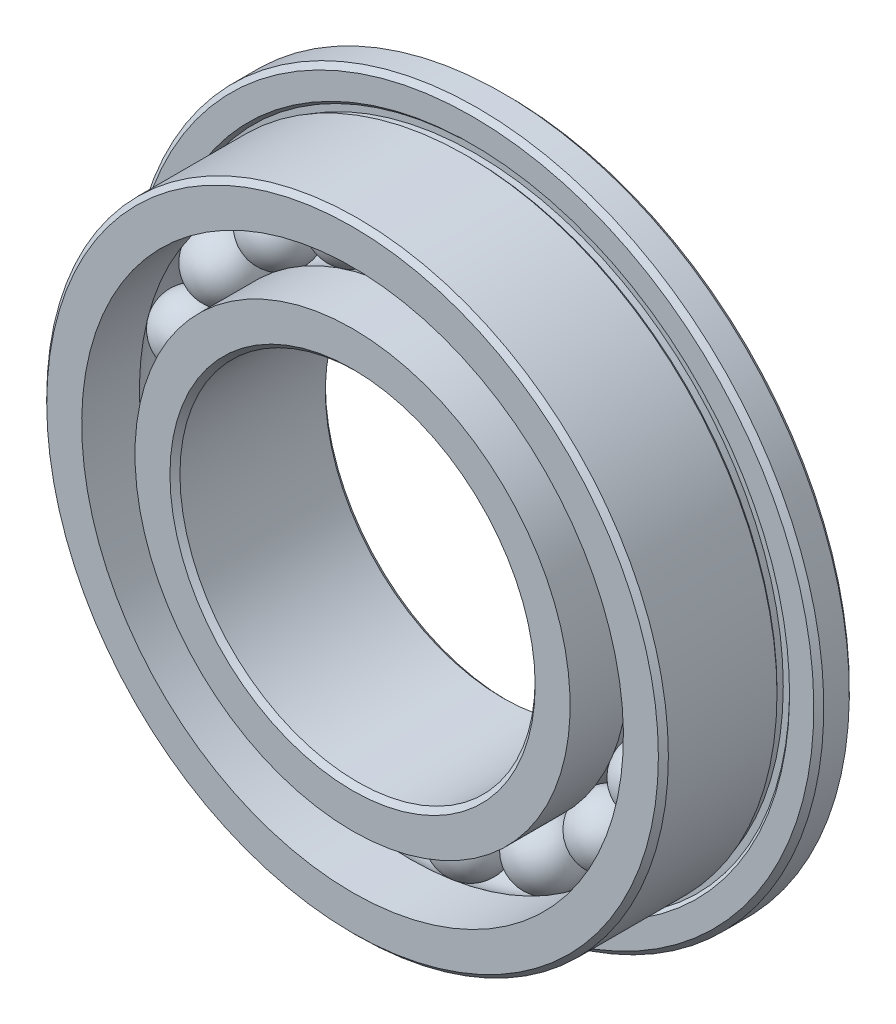
ISO-10303-21;
HEADER;
FILE_DESCRIPTION(('STEP AP214'),'2;1');
FILE_NAME('part.step','',(''),(''),'','','');
FILE_SCHEMA(('AUTOMOTIVE_DESIGN { 1 0 10303 214 1 1 1 1 }'));
ENDSEC;
DATA;
#1=APPLICATION_CONTEXT('core data for automotive mechanical design processes');
#2=APPLICATION_PROTOCOL_DEFINITION('international standard','automotive_design',2000,#1);
#3=PRODUCT_CONTEXT('',#1,'mechanical');
#4=PRODUCT('Part','Part','',(#3));
#5=PRODUCT_RELATED_PRODUCT_CATEGORY('part','',(#4));
#6=PRODUCT_DEFINITION_FORMATION('','',#4);
#7=PRODUCT_DEFINITION_CONTEXT('part definition',#1,'design');
#8=PRODUCT_DEFINITION('design','',#6,#7);
#9=PRODUCT_DEFINITION_SHAPE('','',#8);
#10=(LENGTH_UNIT() NAMED_UNIT(*) SI_UNIT(.MILLI.,.METRE.));
#11=(NAMED_UNIT(*) PLANE_ANGLE_UNIT() SI_UNIT($,.RADIAN.));
#12=(NAMED_UNIT(*) SI_UNIT($,.STERADIAN.) SOLID_ANGLE_UNIT());
#13=UNCERTAINTY_MEASURE_WITH_UNIT(LENGTH_MEASURE(1.E-05),#10,'distance_accuracy_value','');
#14=(GEOMETRIC_REPRESENTATION_CONTEXT(3) GLOBAL_UNCERTAINTY_ASSIGNED_CONTEXT((#13)) GLOBAL_UNIT_ASSIGNED_CONTEXT((#10,
#11,#12)) REPRESENTATION_CONTEXT('',''));
#15=CARTESIAN_POINT('',(0.,0.,0.));
#16=DIRECTION('',(0.,0.,1.));
#17=DIRECTION('',(1.,0.,0.));
#18=AXIS2_PLACEMENT_3D('',#15,#16,#17);
#19=CARTESIAN_POINT('',(-1.78584708062569,5.20199482935352,0.));
#20=DIRECTION('',(-0.324699469204671,0.945817241700639,0.));
#21=DIRECTION('',(0.945817241700639,0.324699469204671,0.));
#22=AXIS2_PLACEMENT_3D('',#19,#20,#21);
#23=SPHERICAL_SURFACE('',#22,0.75);
#24=CARTESIAN_POINT('',(-2.02937168252919,5.911357760629,0.));
#25=VERTEX_POINT('',#24);
#26=VERTEX_LOOP('',#25);
#27=FACE_BOUND('',#26,.T.);
#28=ADVANCED_FACE('F56',(#27),#23,.T.);
#29=CLOSED_SHELL('',(#28));
#30=MANIFOLD_SOLID_BREP('B2',#29);
#31=CARTESIAN_POINT('',(-3.37816991979312,4.34027280168021,0.));
#32=DIRECTION('',(-0.614212712689658,0.789140509396402,0.));
#33=DIRECTION('',(0.789140509396402,0.614212712689658,0.));
#34=AXIS2_PLACEMENT_3D('',#31,#32,#33);
#35=SPHERICAL_SURFACE('',#34,0.75);
#36=CARTESIAN_POINT('',(-3.83882945431036,4.93212818372751,0.));
#37=VERTEX_POINT('',#36);
#38=VERTEX_LOOP('',#37);
#39=FACE_BOUND('',#38,.T.);
#40=ADVANCED_FACE('F77',(#39),#35,.T.);
#41=CLOSED_SHELL('',(#40));
#42=MANIFOLD_SOLID_BREP('B7',#41);
#43=CARTESIAN_POINT('',(-4.60441563044387,3.0082148696734,0.));
#44=DIRECTION('',(-0.837166478262522,0.546948158122437,0.));
#45=DIRECTION('',(0.546948158122437,0.837166478262522,0.));
#46=AXIS2_PLACEMENT_3D('',#43,#44,#45);
#47=SPHERICAL_SURFACE('',#46,0.75);
#48=CARTESIAN_POINT('',(-5.23229048914076,3.41842598826523,0.));
#49=VERTEX_POINT('',#48);
#50=VERTEX_LOOP('',#49);
#51=FACE_BOUND('',#50,.T.);
#52=ADVANCED_FACE('F98',(#51),#47,.T.);
#53=CLOSED_SHELL('',(#52));
#54=MANIFOLD_SOLID_BREP('B52',#53);
#55=CARTESIAN_POINT('',(-5.3317014626663,1.35017017927445,0.));
#56=DIRECTION('',(-0.969400265939328,0.24548548714081,0.));
#57=DIRECTION('',(0.24548548714081,0.969400265939328,0.));
#58=AXIS2_PLACEMENT_3D('',#55,#56,#57);
#59=SPHERICAL_SURFACE('',#58,0.75);
#60=CARTESIAN_POINT('',(-6.0587516621208,1.53428429463006,0.));
#61=VERTEX_POINT('',#60);
#62=VERTEX_LOOP('',#61);
#63=FACE_BOUND('',#62,.T.);
#64=ADVANCED_FACE('F119',(#63),#59,.T.);
#65=CLOSED_SHELL('',(#64));
#66=MANIFOLD_SOLID_BREP('B73',#65);
#67=CARTESIAN_POINT('',(-5.48121471153669,-0.454186400097772,0.));
#68=DIRECTION('',(-0.996584493006671,-0.0825793454723223,0.));
#69=DIRECTION('',(-0.0825793454723223,0.996584493006671,0.));
#70=AXIS2_PLACEMENT_3D('',#67,#68,#69);
#71=SPHERICAL_SURFACE('',#70,0.75);
#72=CARTESIAN_POINT('',(-6.22865308129169,-0.516120909202013,0.));
#73=VERTEX_POINT('',#72);
#74=VERTEX_LOOP('',#73);
#75=FACE_BOUND('',#74,.T.);
#76=ADVANCED_FACE('F140',(#75),#71,.T.);
#77=CLOSED_SHELL('',(#76));
#78=MANIFOLD_SOLID_BREP('B94',#77);
#79=CARTESIAN_POINT('',(-5.03675329660284,-2.20932483559128,0.));
#80=DIRECTION('',(-0.915773326655062,-0.40169542465296,0.));
#81=DIRECTION('',(-0.40169542465296,0.915773326655062,0.));
#82=AXIS2_PLACEMENT_3D('',#79,#80,#81);
#83=SPHERICAL_SURFACE('',#82,0.75);
#84=CARTESIAN_POINT('',(-5.72358329159414,-2.510596404081,0.));
#85=VERTEX_POINT('',#84);
#86=VERTEX_LOOP('',#85);
#87=FACE_BOUND('',#86,.T.);
#88=ADVANCED_FACE('F161',(#87),#83,.T.);
#89=CLOSED_SHELL('',(#88));
#90=MANIFOLD_SOLID_BREP('B115',#89);
#91=CARTESIAN_POINT('',(-4.04648150870226,-3.72504864394154,0.));
#92=DIRECTION('',(-0.735723910673138,-0.677281571625734,0.));
#93=DIRECTION('',(-0.677281571625734,0.735723910673138,0.));
#94=AXIS2_PLACEMENT_3D('',#91,#92,#93);
#95=SPHERICAL_SURFACE('',#94,0.75);
#96=CARTESIAN_POINT('',(-4.59827444170711,-4.23300982266084,0.));
#97=VERTEX_POINT('',#96);
#98=VERTEX_LOOP('',#97);
#99=FACE_BOUND('',#98,.T.);
#100=ADVANCED_FACE('F182',(#99),#95,.T.);
#101=CLOSED_SHELL('',(#100));
#102=MANIFOLD_SOLID_BREP('B136',#101);
#103=CARTESIAN_POINT('',(-2.61771066170394,-4.83710563163567,0.));
#104=DIRECTION('',(-0.475947393037081,-0.879473751206485,0.));
#105=DIRECTION('',(-0.879473751206485,0.475947393037081,0.));
#106=AXIS2_PLACEMENT_3D('',#103,#104,#105);
#107=SPHERICAL_SURFACE('',#106,0.75);
#108=CARTESIAN_POINT('',(-2.97467120648176,-5.49671094504053,0.));
#109=VERTEX_POINT('',#108);
#110=VERTEX_LOOP('',#109);
#111=FACE_BOUND('',#110,.T.);
#112=ADVANCED_FACE('F203',(#111),#107,.T.);
#113=CLOSED_SHELL('',(#112));
#114=MANIFOLD_SOLID_BREP('B157',#113);
#115=CARTESIAN_POINT('',(-0.905270246544077,-5.42498716871497,0.));
#116=DIRECTION('',(-0.164594590280741,-0.986361303402721,0.));
#117=DIRECTION('',(-0.986361303402721,0.164594590280741,0.));
#118=AXIS2_PLACEMENT_3D('',#115,#116,#117);
#119=SPHERICAL_SURFACE('',#118,0.75);
#120=CARTESIAN_POINT('',(-1.02871618925463,-6.16475814626701,0.));
#121=VERTEX_POINT('',#120);
#122=VERTEX_LOOP('',#121);
#123=FACE_BOUND('',#122,.T.);
#124=ADVANCED_FACE('F224',(#123),#119,.T.);
#125=CLOSED_SHELL('',(#124));
#126=MANIFOLD_SOLID_BREP('B178',#125);
#127=CARTESIAN_POINT('',(0.905270246543999,-5.42498716871498,0.));
#128=DIRECTION('',(0.164594590280727,-0.986361303402724,0.));
#129=DIRECTION('',(-0.986361303402724,-0.164594590280727,0.));
#130=AXIS2_PLACEMENT_3D('',#127,#128,#129);
#131=SPHERICAL_SURFACE('',#130,0.75);
#132=CARTESIAN_POINT('',(1.02871618925454,-6.16475814626702,0.));
#133=VERTEX_POINT('',#132);
#134=VERTEX_LOOP('',#133);
#135=FACE_BOUND('',#134,.T.);
#136=ADVANCED_FACE('F245',(#135),#131,.T.);
#137=CLOSED_SHELL('',(#136));
#138=MANIFOLD_SOLID_BREP('B199',#137);
#139=CARTESIAN_POINT('',(2.61771066170388,-4.8371056316357,0.));
#140=DIRECTION('',(0.475947393037068,-0.879473751206492,0.));
#141=DIRECTION('',(-0.879473751206492,-0.475947393037068,0.));
#142=AXIS2_PLACEMENT_3D('',#139,#140,#141);
#143=SPHERICAL_SURFACE('',#142,0.75);
#144=CARTESIAN_POINT('',(2.97467120648168,-5.49671094504057,0.));
#145=VERTEX_POINT('',#144);
#146=VERTEX_LOOP('',#145);
#147=FACE_BOUND('',#146,.T.);
#148=ADVANCED_FACE('F266',(#147),#143,.T.);
#149=CLOSED_SHELL('',(#148));
#150=MANIFOLD_SOLID_BREP('B220',#149);
#151=CARTESIAN_POINT('',(4.0464815087022,-3.7250486439416,0.));
#152=DIRECTION('',(0.735723910673128,-0.677281571625745,0.));
#153=DIRECTION('',(-0.677281571625745,-0.735723910673128,0.));
#154=AXIS2_PLACEMENT_3D('',#151,#152,#153);
#155=SPHERICAL_SURFACE('',#154,0.75);
#156=CARTESIAN_POINT('',(4.59827444170705,-4.2330098226609,0.));
#157=VERTEX_POINT('',#156);
#158=VERTEX_LOOP('',#157);
#159=FACE_BOUND('',#158,.T.);
#160=ADVANCED_FACE('F287',(#159),#155,.T.);
#161=CLOSED_SHELL('',(#160));
#162=MANIFOLD_SOLID_BREP('B241',#161);
#163=CARTESIAN_POINT('',(5.03675329660281,-2.20932483559136,0.));
#164=DIRECTION('',(0.915773326655056,-0.401695424652974,0.));
#165=DIRECTION('',(-0.401695424652974,-0.915773326655056,0.));
#166=AXIS2_PLACEMENT_3D('',#163,#164,#165);
#167=SPHERICAL_SURFACE('',#166,0.75);
#168=CARTESIAN_POINT('',(5.7235832915941,-2.51059640408109,0.));
#169=VERTEX_POINT('',#168);
#170=VERTEX_LOOP('',#169);
#171=FACE_BOUND('',#170,.T.);
#172=ADVANCED_FACE('F308',(#171),#167,.T.);
#173=CLOSED_SHELL('',(#172));
#174=MANIFOLD_SOLID_BREP('B262',#173);
#175=CARTESIAN_POINT('',(5.48121471153668,-0.454186400097848,0.));
#176=DIRECTION('',(0.99658449300667,-0.0825793454723359,0.));
#177=DIRECTION('',(-0.0825793454723359,-0.99658449300667,0.));
#178=AXIS2_PLACEMENT_3D('',#175,#176,#177);
#179=SPHERICAL_SURFACE('',#178,0.75);
#180=CARTESIAN_POINT('',(6.22865308129169,-0.5161209092021,0.));
#181=VERTEX_POINT('',#180);
#182=VERTEX_LOOP('',#181);
#183=FACE_BOUND('',#182,.T.);
#184=ADVANCED_FACE('F329',(#183),#179,.T.);
#185=CLOSED_SHELL('',(#184));
#186=MANIFOLD_SOLID_BREP('B283',#185);
#187=CARTESIAN_POINT('',(5.33170146266632,1.35017017927438,0.));
#188=DIRECTION('',(0.969400265939331,0.245485487140796,0.));
#189=DIRECTION('',(0.245485487140796,-0.969400265939331,0.));
#190=AXIS2_PLACEMENT_3D('',#187,#188,#189);
#191=SPHERICAL_SURFACE('',#190,0.75);
#192=CARTESIAN_POINT('',(6.05875166212082,1.53428429462998,0.));
#193=VERTEX_POINT('',#192);
#194=VERTEX_LOOP('',#193);
#195=FACE_BOUND('',#194,.T.);
#196=ADVANCED_FACE('F350',(#195),#191,.T.);
#197=CLOSED_SHELL('',(#196));
#198=MANIFOLD_SOLID_BREP('B304',#197);
#199=CARTESIAN_POINT('',(4.60441563044391,3.00821486967334,0.));
#200=DIRECTION('',(0.83716647826253,0.546948158122425,0.));
#201=DIRECTION('',(0.546948158122425,-0.83716647826253,0.));
#202=AXIS2_PLACEMENT_3D('',#199,#200,#201);
#203=SPHERICAL_SURFACE('',#202,0.75);
#204=CARTESIAN_POINT('',(5.23229048914081,3.41842598826516,0.));
#205=VERTEX_POINT('',#204);
#206=VERTEX_LOOP('',#205);
#207=FACE_BOUND('',#206,.T.);
#208=ADVANCED_FACE('F371',(#207),#203,.T.);
#209=CLOSED_SHELL('',(#208));
#210=MANIFOLD_SOLID_BREP('B325',#209);
#211=CARTESIAN_POINT('',(3.37816991979318,4.34027280168016,0.));
#212=DIRECTION('',(0.614212712689669,0.789140509396393,0.));
#213=DIRECTION('',(0.789140509396393,-0.614212712689669,0.));
#214=AXIS2_PLACEMENT_3D('',#211,#212,#213);
#215=SPHERICAL_SURFACE('',#214,0.75);
#216=CARTESIAN_POINT('',(3.83882945431043,4.93212818372745,0.));
#217=VERTEX_POINT('',#216);
#218=VERTEX_LOOP('',#217);
#219=FACE_BOUND('',#218,.T.);
#220=ADVANCED_FACE('F392',(#219),#215,.T.);
#221=CLOSED_SHELL('',(#220));
#222=MANIFOLD_SOLID_BREP('B346',#221);
#223=CARTESIAN_POINT('',(1.78584708062576,5.20199482935349,0.));
#224=DIRECTION('',(0.324699469204684,0.945817241700635,0.));
#225=DIRECTION('',(0.945817241700635,-0.324699469204684,0.));
#226=AXIS2_PLACEMENT_3D('',#223,#224,#225);
#227=SPHERICAL_SURFACE('',#226,0.75);
#228=CARTESIAN_POINT('',(2.02937168252928,5.91135776062897,0.));
#229=VERTEX_POINT('',#228);
#230=VERTEX_LOOP('',#229);
#231=FACE_BOUND('',#230,.T.);
#232=ADVANCED_FACE('F413',(#231),#227,.T.);
#233=CLOSED_SHELL('',(#232));
#234=MANIFOLD_SOLID_BREP('B367',#233);
#235=CARTESIAN_POINT('',(0.,5.5,0.));
#236=DIRECTION('',(0.,1.,0.));
#237=DIRECTION('',(1.,0.,0.));
#238=AXIS2_PLACEMENT_3D('',#235,#236,#237);
#239=SPHERICAL_SURFACE('',#238,0.75);
#240=CARTESIAN_POINT('',(0.,6.25,0.));
#241=VERTEX_POINT('',#240);
#242=VERTEX_LOOP('',#241);
#243=FACE_BOUND('',#242,.T.);
#244=ADVANCED_FACE('F437',(#243),#239,.T.);
#245=CLOSED_SHELL('',(#244));
#246=MANIFOLD_SOLID_BREP('B388',#245);
#247=CARTESIAN_POINT('',(0.,0.,0.));
#248=DIRECTION('',(0.,0.,1.));
#249=DIRECTION('',(0.,-1.,0.));
#250=AXIS2_PLACEMENT_3D('',#247,#248,#249);
#251=CYLINDRICAL_SURFACE('',#250,4.9);
#252=CARTESIAN_POINT('',(0.,0.,-0.449999999999999));
#253=DIRECTION('',(0.,0.,1.));
#254=DIRECTION('',(0.,-1.,0.));
#255=AXIS2_PLACEMENT_3D('',#252,#253,#254);
#256=CIRCLE('',#255,4.9);
#257=CARTESIAN_POINT('',(0.,-4.9,-0.449999999999999));
#258=VERTEX_POINT('',#257);
#259=EDGE_CURVE('E485',#258,#258,#256,.T.);
#260=ORIENTED_EDGE('',*,*,#259,.F.);
#261=EDGE_LOOP('',(#260));
#262=FACE_BOUND('',#261,.T.);
#263=CARTESIAN_POINT('',(0.,0.,-1.75));
#264=DIRECTION('',(0.,0.,1.));
#265=DIRECTION('',(0.,-1.,0.));
#266=AXIS2_PLACEMENT_3D('',#263,#264,#265);
#267=CIRCLE('',#266,4.9);
#268=CARTESIAN_POINT('',(0.,-4.9,-1.75));
#269=VERTEX_POINT('',#268);
#270=EDGE_CURVE('E497',#269,#269,#267,.T.);
#271=ORIENTED_EDGE('',*,*,#270,.T.);
#272=EDGE_LOOP('',(#271));
#273=FACE_BOUND('',#272,.T.);
#274=ADVANCED_FACE('F459',(#262,#273),#251,.T.);
#275=CARTESIAN_POINT('',(0.,0.,0.));
#276=DIRECTION('',(0.,0.,1.));
#277=DIRECTION('',(0.,-1.,0.));
#278=AXIS2_PLACEMENT_3D('',#275,#276,#277);
#279=TOROIDAL_SURFACE('',#278,5.5,0.75);
#280=CARTESIAN_POINT('',(0.,0.,0.45));
#281=DIRECTION('',(0.,0.,1.));
#282=DIRECTION('',(0.,-1.,0.));
#283=AXIS2_PLACEMENT_3D('',#280,#281,#282);
#284=CIRCLE('',#283,4.9);
#285=CARTESIAN_POINT('',(0.,-4.9,0.45));
#286=VERTEX_POINT('',#285);
#287=EDGE_CURVE('E489',#286,#286,#284,.T.);
#288=ORIENTED_EDGE('',*,*,#287,.F.);
#289=EDGE_LOOP('',(#288));
#290=FACE_BOUND('',#289,.T.);
#291=ORIENTED_EDGE('',*,*,#259,.T.);
#292=EDGE_LOOP('',(#291));
#293=FACE_BOUND('',#292,.T.);
#294=ADVANCED_FACE('F518',(#290,#293),#279,.F.);
#295=CARTESIAN_POINT('',(0.,0.,0.));
#296=DIRECTION('',(0.,0.,1.));
#297=DIRECTION('',(0.,-1.,0.));
#298=AXIS2_PLACEMENT_3D('',#295,#296,#297);
#299=CYLINDRICAL_SURFACE('',#298,4.9);
#300=CARTESIAN_POINT('',(0.,0.,1.75));
#301=DIRECTION('',(0.,0.,1.));
#302=DIRECTION('',(0.,-1.,0.));
#303=AXIS2_PLACEMENT_3D('',#300,#301,#302);
#304=CIRCLE('',#303,4.9);
#305=CARTESIAN_POINT('',(0.,-4.9,1.75));
#306=VERTEX_POINT('',#305);
#307=EDGE_CURVE('E493',#306,#306,#304,.T.);
#308=ORIENTED_EDGE('',*,*,#307,.F.);
#309=EDGE_LOOP('',(#308));
#310=FACE_BOUND('',#309,.T.);
#311=ORIENTED_EDGE('',*,*,#287,.T.);
#312=EDGE_LOOP('',(#311));
#313=FACE_BOUND('',#312,.T.);
#314=ADVANCED_FACE('F524',(#310,#313),#299,.T.);
#315=CARTESIAN_POINT('',(0.,4.,1.75));
#316=DIRECTION('',(0.,0.,-1.));
#317=DIRECTION('',(0.,1.,0.));
#318=AXIS2_PLACEMENT_3D('',#315,#316,#317);
#319=PLANE('',#318);
#320=CARTESIAN_POINT('',(0.,0.,1.75));
#321=DIRECTION('',(0.,0.,-1.));
#322=DIRECTION('',(0.,1.,0.));
#323=AXIS2_PLACEMENT_3D('',#320,#321,#322);
#324=CIRCLE('',#323,4.1125);
#325=CARTESIAN_POINT('',(0.,4.1125,1.75));
#326=VERTEX_POINT('',#325);
#327=EDGE_CURVE('E436',#326,#326,#324,.T.);
#328=ORIENTED_EDGE('',*,*,#327,.T.);
#329=EDGE_LOOP('',(#328));
#330=FACE_BOUND('',#329,.T.);
#331=ORIENTED_EDGE('',*,*,#307,.T.);
#332=EDGE_LOOP('',(#331));
#333=FACE_BOUND('',#332,.T.);
#334=ADVANCED_FACE('F515',(#330,#333),#319,.F.);
#335=CARTESIAN_POINT('',(0.,0.,0.));
#336=DIRECTION('',(0.,0.,1.));
#337=DIRECTION('',(0.,-1.,0.));
#338=AXIS2_PLACEMENT_3D('',#335,#336,#337);
#339=CYLINDRICAL_SURFACE('',#338,4.);
#340=CARTESIAN_POINT('',(0.,0.,-1.6375));
#341=DIRECTION('',(0.,0.,1.));
#342=DIRECTION('',(0.,-1.,0.));
#343=AXIS2_PLACEMENT_3D('',#340,#341,#342);
#344=CIRCLE('',#343,4.);
#345=CARTESIAN_POINT('',(0.,-4.,-1.6375));
#346=VERTEX_POINT('',#345);
#347=EDGE_CURVE('E467',#346,#346,#344,.F.);
#348=ORIENTED_EDGE('',*,*,#347,.T.);
#349=EDGE_LOOP('',(#348));
#350=FACE_BOUND('',#349,.T.);
#351=CARTESIAN_POINT('',(0.,0.,1.6375));
#352=DIRECTION('',(0.,0.,-1.));
#353=DIRECTION('',(0.,1.,0.));
#354=AXIS2_PLACEMENT_3D('',#351,#352,#353);
#355=CIRCLE('',#354,4.);
#356=CARTESIAN_POINT('',(0.,4.,1.6375));
#357=VERTEX_POINT('',#356);
#358=EDGE_CURVE('E473',#357,#357,#355,.F.);
#359=ORIENTED_EDGE('',*,*,#358,.T.);
#360=EDGE_LOOP('',(#359));
#361=FACE_BOUND('',#360,.T.);
#362=ADVANCED_FACE('F507',(#350,#361),#339,.F.);
#363=CARTESIAN_POINT('',(0.,4.9,-1.75));
#364=DIRECTION('',(0.,0.,1.));
#365=DIRECTION('',(0.,-1.,0.));
#366=AXIS2_PLACEMENT_3D('',#363,#364,#365);
#367=PLANE('',#366);
#368=CARTESIAN_POINT('',(0.,0.,-1.75));
#369=DIRECTION('',(0.,0.,1.));
#370=DIRECTION('',(0.,-1.,0.));
#371=AXIS2_PLACEMENT_3D('',#368,#369,#370);
#372=CIRCLE('',#371,4.1125);
#373=CARTESIAN_POINT('',(0.,-4.1125,-1.75));
#374=VERTEX_POINT('',#373);
#375=EDGE_CURVE('E479',#374,#374,#372,.T.);
#376=ORIENTED_EDGE('',*,*,#375,.T.);
#377=EDGE_LOOP('',(#376));
#378=FACE_BOUND('',#377,.T.);
#379=ORIENTED_EDGE('',*,*,#270,.F.);
#380=EDGE_LOOP('',(#379));
#381=FACE_BOUND('',#380,.T.);
#382=ADVANCED_FACE('F504',(#378,#381),#367,.F.);
#383=CARTESIAN_POINT('',(0.,0.,-1.75));
#384=DIRECTION('',(0.,0.,-1.));
#385=DIRECTION('',(0.,1.,0.));
#386=AXIS2_PLACEMENT_3D('',#383,#384,#385);
#387=CONICAL_SURFACE('',#386,4.1125,0.785398163397446);
#388=ORIENTED_EDGE('',*,*,#347,.F.);
#389=EDGE_LOOP('',(#388));
#390=FACE_BOUND('',#389,.T.);
#391=ORIENTED_EDGE('',*,*,#375,.F.);
#392=EDGE_LOOP('',(#391));
#393=FACE_BOUND('',#392,.T.);
#394=ADVANCED_FACE('F506',(#390,#393),#387,.F.);
#395=CARTESIAN_POINT('',(0.,0.,1.6375));
#396=DIRECTION('',(0.,0.,1.));
#397=DIRECTION('',(0.,-1.,0.));
#398=AXIS2_PLACEMENT_3D('',#395,#396,#397);
#399=CONICAL_SURFACE('',#398,4.,0.785398163397446);
#400=ORIENTED_EDGE('',*,*,#327,.F.);
#401=EDGE_LOOP('',(#400));
#402=FACE_BOUND('',#401,.T.);
#403=ORIENTED_EDGE('',*,*,#358,.F.);
#404=EDGE_LOOP('',(#403));
#405=FACE_BOUND('',#404,.T.);
#406=ADVANCED_FACE('F461',(#402,#405),#399,.F.);
#407=CLOSED_SHELL('',(#274,#294,#314,#334,#362,#382,#394,#406));
#408=MANIFOLD_SOLID_BREP('B409',#407);
#409=CARTESIAN_POINT('',(0.,6.1,-1.75));
#410=DIRECTION('',(0.,0.,1.));
#411=DIRECTION('',(0.,-1.,0.));
#412=AXIS2_PLACEMENT_3D('',#409,#410,#411);
#413=PLANE('',#412);
#414=CARTESIAN_POINT('',(0.,0.,-1.75));
#415=DIRECTION('',(0.,0.,1.));
#416=DIRECTION('',(0.,-1.,0.));
#417=AXIS2_PLACEMENT_3D('',#414,#415,#416);
#418=CIRCLE('',#417,7.6875);
#419=CARTESIAN_POINT('',(0.,-7.6875,-1.75));
#420=VERTEX_POINT('',#419);
#421=EDGE_CURVE('E618',#420,#420,#418,.F.);
#422=ORIENTED_EDGE('',*,*,#421,.T.);
#423=EDGE_LOOP('',(#422));
#424=FACE_BOUND('',#423,.T.);
#425=CARTESIAN_POINT('',(0.,0.,-1.75));
#426=DIRECTION('',(0.,0.,1.));
#427=DIRECTION('',(0.,-1.,0.));
#428=AXIS2_PLACEMENT_3D('',#425,#426,#427);
#429=CIRCLE('',#428,6.1);
#430=CARTESIAN_POINT('',(0.,-6.1,-1.75));
#431=VERTEX_POINT('',#430);
#432=EDGE_CURVE('E632',#431,#431,#429,.T.);
#433=ORIENTED_EDGE('',*,*,#432,.T.);
#434=EDGE_LOOP('',(#433));
#435=FACE_BOUND('',#434,.T.);
#436=ADVANCED_FACE('F598',(#424,#435),#413,.F.);
#437=CARTESIAN_POINT('',(0.,0.,0.));
#438=DIRECTION('',(0.,0.,1.));
#439=DIRECTION('',(0.,-1.,0.));
#440=AXIS2_PLACEMENT_3D('',#437,#438,#439);
#441=CYLINDRICAL_SURFACE('',#440,6.1);
#442=ORIENTED_EDGE('',*,*,#432,.F.);
#443=EDGE_LOOP('',(#442));
#444=FACE_BOUND('',#443,.T.);
#445=CARTESIAN_POINT('',(0.,0.,-0.45));
#446=DIRECTION('',(0.,0.,1.));
#447=DIRECTION('',(0.,-1.,0.));
#448=AXIS2_PLACEMENT_3D('',#445,#446,#447);
#449=CIRCLE('',#448,6.1);
#450=CARTESIAN_POINT('',(0.,-6.1,-0.45));
#451=VERTEX_POINT('',#450);
#452=EDGE_CURVE('E636',#451,#451,#449,.T.);
#453=ORIENTED_EDGE('',*,*,#452,.T.);
#454=EDGE_LOOP('',(#453));
#455=FACE_BOUND('',#454,.T.);
#456=ADVANCED_FACE('F688',(#444,#455),#441,.F.);
#457=CARTESIAN_POINT('',(0.,0.,0.));
#458=DIRECTION('',(0.,0.,1.));
#459=DIRECTION('',(0.,-1.,0.));
#460=AXIS2_PLACEMENT_3D('',#457,#458,#459);
#461=TOROIDAL_SURFACE('',#460,5.5,0.75);
#462=ORIENTED_EDGE('',*,*,#452,.F.);
#463=EDGE_LOOP('',(#462));
#464=FACE_BOUND('',#463,.T.);
#465=CARTESIAN_POINT('',(0.,0.,0.45));
#466=DIRECTION('',(0.,0.,1.));
#467=DIRECTION('',(0.,-1.,0.));
#468=AXIS2_PLACEMENT_3D('',#465,#466,#467);
#469=CIRCLE('',#468,6.1);
#470=CARTESIAN_POINT('',(0.,-6.1,0.45));
#471=VERTEX_POINT('',#470);
#472=EDGE_CURVE('E640',#471,#471,#469,.T.);
#473=ORIENTED_EDGE('',*,*,#472,.T.);
#474=EDGE_LOOP('',(#473));
#475=FACE_BOUND('',#474,.T.);
#476=ADVANCED_FACE('F694',(#464,#475),#461,.F.);
#477=CARTESIAN_POINT('',(0.,0.,0.));
#478=DIRECTION('',(0.,0.,1.));
#479=DIRECTION('',(0.,-1.,0.));
#480=AXIS2_PLACEMENT_3D('',#477,#478,#479);
#481=CYLINDRICAL_SURFACE('',#480,6.1);
#482=ORIENTED_EDGE('',*,*,#472,.F.);
#483=EDGE_LOOP('',(#482));
#484=FACE_BOUND('',#483,.T.);
#485=CARTESIAN_POINT('',(0.,0.,1.75));
#486=DIRECTION('',(0.,0.,1.));
#487=DIRECTION('',(0.,-1.,0.));
#488=AXIS2_PLACEMENT_3D('',#485,#486,#487);
#489=CIRCLE('',#488,6.1);
#490=CARTESIAN_POINT('',(0.,-6.1,1.75));
#491=VERTEX_POINT('',#490);
#492=EDGE_CURVE('E644',#491,#491,#489,.T.);
#493=ORIENTED_EDGE('',*,*,#492,.T.);
#494=EDGE_LOOP('',(#493));
#495=FACE_BOUND('',#494,.T.);
#496=ADVANCED_FACE('F758',(#484,#495),#481,.F.);
#497=CARTESIAN_POINT('',(0.,7.,1.75));
#498=DIRECTION('',(0.,0.,-1.));
#499=DIRECTION('',(0.,1.,0.));
#500=AXIS2_PLACEMENT_3D('',#497,#498,#499);
#501=PLANE('',#500);
#502=CARTESIAN_POINT('',(0.,0.,1.75));
#503=DIRECTION('',(0.,0.,-1.));
#504=DIRECTION('',(0.,1.,0.));
#505=AXIS2_PLACEMENT_3D('',#502,#503,#504);
#506=CIRCLE('',#505,6.8875);
#507=CARTESIAN_POINT('',(0.,6.8875,1.75));
#508=VERTEX_POINT('',#507);
#509=EDGE_CURVE('E606',#508,#508,#506,.F.);
#510=ORIENTED_EDGE('',*,*,#509,.T.);
#511=EDGE_LOOP('',(#510));
#512=FACE_BOUND('',#511,.T.);
#513=ORIENTED_EDGE('',*,*,#492,.F.);
#514=EDGE_LOOP('',(#513));
#515=FACE_BOUND('',#514,.T.);
#516=ADVANCED_FACE('F748',(#512,#515),#501,.F.);
#517=CARTESIAN_POINT('',(0.,0.,0.));
#518=DIRECTION('',(0.,0.,1.));
#519=DIRECTION('',(0.,-1.,0.));
#520=AXIS2_PLACEMENT_3D('',#517,#518,#519);
#521=CYLINDRICAL_SURFACE('',#520,7.);
#522=CARTESIAN_POINT('',(0.,0.,1.6375));
#523=DIRECTION('',(0.,0.,-1.));
#524=DIRECTION('',(0.,1.,0.));
#525=AXIS2_PLACEMENT_3D('',#522,#523,#524);
#526=CIRCLE('',#525,7.);
#527=CARTESIAN_POINT('',(0.,7.,1.6375));
#528=VERTEX_POINT('',#527);
#529=EDGE_CURVE('E458',#528,#528,#526,.T.);
#530=ORIENTED_EDGE('',*,*,#529,.T.);
#531=EDGE_LOOP('',(#530));
#532=FACE_BOUND('',#531,.T.);
#533=CARTESIAN_POINT('',(0.,0.,-0.808578643762693));
#534=DIRECTION('',(0.,0.,1.));
#535=DIRECTION('',(0.,-1.,0.));
#536=AXIS2_PLACEMENT_3D('',#533,#534,#535);
#537=CIRCLE('',#536,7.);
#538=CARTESIAN_POINT('',(0.,-7.,-0.808578643762693));
#539=VERTEX_POINT('',#538);
#540=EDGE_CURVE('E648',#539,#539,#537,.T.);
#541=ORIENTED_EDGE('',*,*,#540,.T.);
#542=EDGE_LOOP('',(#541));
#543=FACE_BOUND('',#542,.T.);
#544=ADVANCED_FACE('F742',(#532,#543),#521,.T.);
#545=CARTESIAN_POINT('',(0.,0.,-0.879289321881346));
#546=DIRECTION('',(0.,0.,1.));
#547=DIRECTION('',(0.,-1.,0.));
#548=AXIS2_PLACEMENT_3D('',#545,#546,#547);
#549=CONICAL_SURFACE('',#548,6.92928932188135,0.78539816339745);
#550=ORIENTED_EDGE('',*,*,#540,.F.);
#551=EDGE_LOOP('',(#550));
#552=FACE_BOUND('',#551,.T.);
#553=CARTESIAN_POINT('',(0.,0.,-0.879289321881346));
#554=DIRECTION('',(0.,0.,1.));
#555=DIRECTION('',(0.,-1.,0.));
#556=AXIS2_PLACEMENT_3D('',#553,#554,#555);
#557=CIRCLE('',#556,6.92928932188135);
#558=CARTESIAN_POINT('',(0.,-6.92928932188135,-0.879289321881347));
#559=VERTEX_POINT('',#558);
#560=EDGE_CURVE('E652',#559,#559,#557,.T.);
#561=ORIENTED_EDGE('',*,*,#560,.T.);
#562=EDGE_LOOP('',(#561));
#563=FACE_BOUND('',#562,.T.);
#564=ADVANCED_FACE('F747',(#552,#563),#549,.T.);
#565=CARTESIAN_POINT('',(0.,0.,0.));
#566=DIRECTION('',(0.,0.,1.));
#567=DIRECTION('',(0.,-1.,0.));
#568=AXIS2_PLACEMENT_3D('',#565,#566,#567);
#569=CYLINDRICAL_SURFACE('',#568,6.92928932188135);
#570=ORIENTED_EDGE('',*,*,#560,.F.);
#571=EDGE_LOOP('',(#570));
#572=FACE_BOUND('',#571,.T.);
#573=CARTESIAN_POINT('',(0.,0.,-1.02071067811866));
#574=DIRECTION('',(0.,0.,1.));
#575=DIRECTION('',(0.,-1.,0.));
#576=AXIS2_PLACEMENT_3D('',#573,#574,#575);
#577=CIRCLE('',#576,6.92928932188135);
#578=CARTESIAN_POINT('',(0.,-6.92928932188135,-1.02071067811866));
#579=VERTEX_POINT('',#578);
#580=EDGE_CURVE('E656',#579,#579,#577,.T.);
#581=ORIENTED_EDGE('',*,*,#580,.T.);
#582=EDGE_LOOP('',(#581));
#583=FACE_BOUND('',#582,.T.);
#584=ADVANCED_FACE('F780',(#572,#583),#569,.T.);
#585=CARTESIAN_POINT('',(0.,7.07071067811866,-1.02071067811866));
#586=DIRECTION('',(0.,0.,-1.));
#587=DIRECTION('',(0.,1.,0.));
#588=AXIS2_PLACEMENT_3D('',#585,#586,#587);
#589=PLANE('',#588);
#590=ORIENTED_EDGE('',*,*,#580,.F.);
#591=EDGE_LOOP('',(#590));
#592=FACE_BOUND('',#591,.T.);
#593=CARTESIAN_POINT('',(0.,0.,-1.02071067811866));
#594=DIRECTION('',(0.,0.,1.));
#595=DIRECTION('',(0.,-1.,0.));
#596=AXIS2_PLACEMENT_3D('',#593,#594,#595);
#597=CIRCLE('',#596,7.07071067811866);
#598=CARTESIAN_POINT('',(0.,-7.07071067811866,-1.02071067811866));
#599=VERTEX_POINT('',#598);
#600=EDGE_CURVE('E660',#599,#599,#597,.T.);
#601=ORIENTED_EDGE('',*,*,#600,.T.);
#602=EDGE_LOOP('',(#601));
#603=FACE_BOUND('',#602,.T.);
#604=ADVANCED_FACE('F684',(#592,#603),#589,.F.);
#605=CARTESIAN_POINT('',(0.,0.,-0.950000000000001));
#606=DIRECTION('',(0.,0.,1.));
#607=DIRECTION('',(0.,-1.,0.));
#608=AXIS2_PLACEMENT_3D('',#605,#606,#607);
#609=CONICAL_SURFACE('',#608,7.14142135623731,0.785398163397448);
#610=ORIENTED_EDGE('',*,*,#600,.F.);
#611=EDGE_LOOP('',(#610));
#612=FACE_BOUND('',#611,.T.);
#613=CARTESIAN_POINT('',(0.,0.,-0.950000000000001));
#614=DIRECTION('',(0.,0.,1.));
#615=DIRECTION('',(0.,-1.,0.));
#616=AXIS2_PLACEMENT_3D('',#613,#614,#615);
#617=CIRCLE('',#616,7.14142135623731);
#618=CARTESIAN_POINT('',(0.,-7.14142135623731,-0.950000000000001));
#619=VERTEX_POINT('',#618);
#620=EDGE_CURVE('E664',#619,#619,#617,.T.);
#621=ORIENTED_EDGE('',*,*,#620,.T.);
#622=EDGE_LOOP('',(#621));
#623=FACE_BOUND('',#622,.T.);
#624=ADVANCED_FACE('F670',(#612,#623),#609,.F.);
#625=CARTESIAN_POINT('',(0.,7.8,-0.950000000000001));
#626=DIRECTION('',(0.,0.,-1.));
#627=DIRECTION('',(0.,1.,0.));
#628=AXIS2_PLACEMENT_3D('',#625,#626,#627);
#629=PLANE('',#628);
#630=CARTESIAN_POINT('',(0.,0.,-0.950000000000001));
#631=DIRECTION('',(0.,0.,-1.));
#632=DIRECTION('',(0.,1.,0.));
#633=AXIS2_PLACEMENT_3D('',#630,#631,#632);
#634=CIRCLE('',#633,7.6875);
#635=CARTESIAN_POINT('',(0.,7.6875,-0.95));
#636=VERTEX_POINT('',#635);
#637=EDGE_CURVE('E612',#636,#636,#634,.F.);
#638=ORIENTED_EDGE('',*,*,#637,.T.);
#639=EDGE_LOOP('',(#638));
#640=FACE_BOUND('',#639,.T.);
#641=ORIENTED_EDGE('',*,*,#620,.F.);
#642=EDGE_LOOP('',(#641));
#643=FACE_BOUND('',#642,.T.);
#644=ADVANCED_FACE('F672',(#640,#643),#629,.F.);
#645=CARTESIAN_POINT('',(0.,0.,0.));
#646=DIRECTION('',(0.,0.,1.));
#647=DIRECTION('',(0.,-1.,0.));
#648=AXIS2_PLACEMENT_3D('',#645,#646,#647);
#649=CYLINDRICAL_SURFACE('',#648,7.8);
#650=CARTESIAN_POINT('',(0.,0.,-1.6375));
#651=DIRECTION('',(0.,0.,1.));
#652=DIRECTION('',(0.,-1.,0.));
#653=AXIS2_PLACEMENT_3D('',#650,#651,#652);
#654=CIRCLE('',#653,7.8);
#655=CARTESIAN_POINT('',(0.,-7.8,-1.6375));
#656=VERTEX_POINT('',#655);
#657=EDGE_CURVE('E624',#656,#656,#654,.T.);
#658=ORIENTED_EDGE('',*,*,#657,.T.);
#659=EDGE_LOOP('',(#658));
#660=FACE_BOUND('',#659,.T.);
#661=CARTESIAN_POINT('',(0.,0.,-1.0625));
#662=DIRECTION('',(0.,0.,-1.));
#663=DIRECTION('',(0.,1.,0.));
#664=AXIS2_PLACEMENT_3D('',#661,#662,#663);
#665=CIRCLE('',#664,7.8);
#666=CARTESIAN_POINT('',(0.,7.8,-1.0625));
#667=VERTEX_POINT('',#666);
#668=EDGE_CURVE('E628',#667,#667,#665,.T.);
#669=ORIENTED_EDGE('',*,*,#668,.T.);
#670=EDGE_LOOP('',(#669));
#671=FACE_BOUND('',#670,.T.);
#672=ADVANCED_FACE('F674',(#660,#671),#649,.T.);
#673=CARTESIAN_POINT('',(0.,0.,-1.6375));
#674=DIRECTION('',(0.,0.,1.));
#675=DIRECTION('',(0.,-1.,0.));
#676=AXIS2_PLACEMENT_3D('',#673,#674,#675);
#677=CONICAL_SURFACE('',#676,7.8,0.785398163397446);
#678=ORIENTED_EDGE('',*,*,#421,.F.);
#679=EDGE_LOOP('',(#678));
#680=FACE_BOUND('',#679,.T.);
#681=ORIENTED_EDGE('',*,*,#657,.F.);
#682=EDGE_LOOP('',(#681));
#683=FACE_BOUND('',#682,.T.);
#684=ADVANCED_FACE('F681',(#680,#683),#677,.T.);
#685=CARTESIAN_POINT('',(0.,0.,-0.950000000000001));
#686=DIRECTION('',(0.,0.,-1.));
#687=DIRECTION('',(0.,1.,0.));
#688=AXIS2_PLACEMENT_3D('',#685,#686,#687);
#689=CONICAL_SURFACE('',#688,7.6875,0.785398163397446);
#690=CARTESIAN_POINT('',(0.,7.8,-1.0625));
#691=CARTESIAN_POINT('',(0.,7.798828125,-1.061328125));
#692=CARTESIAN_POINT('',(0.,7.79765625,-1.06015625));
#693=CARTESIAN_POINT('',(0.,7.7953125,-1.0578125));
#694=CARTESIAN_POINT('',(0.,7.794140625,-1.056640625));
#695=CARTESIAN_POINT('',(0.,7.791796875,-1.054296875));
#696=CARTESIAN_POINT('',(0.,7.790625,-1.053125));
#697=CARTESIAN_POINT('',(0.,7.78828125,-1.05078125));
#698=CARTESIAN_POINT('',(0.,7.787109375,-1.049609375));
#699=CARTESIAN_POINT('',(0.,7.784765625,-1.047265625));
#700=CARTESIAN_POINT('',(0.,7.78359375,-1.04609375));
#701=CARTESIAN_POINT('',(0.,7.78125,-1.04375));
#702=CARTESIAN_POINT('',(0.,7.780078125,-1.042578125));
#703=CARTESIAN_POINT('',(0.,7.777734375,-1.040234375));
#704=CARTESIAN_POINT('',(0.,7.7765625,-1.0390625));
#705=CARTESIAN_POINT('',(0.,7.77421875,-1.03671875));
#706=CARTESIAN_POINT('',(0.,7.773046875,-1.035546875));
#707=CARTESIAN_POINT('',(0.,7.770703125,-1.033203125));
#708=CARTESIAN_POINT('',(0.,7.76953125,-1.03203125));
#709=CARTESIAN_POINT('',(0.,7.7671875,-1.0296875));
#710=CARTESIAN_POINT('',(0.,7.766015625,-1.028515625));
#711=CARTESIAN_POINT('',(0.,7.763671875,-1.026171875));
#712=CARTESIAN_POINT('',(0.,7.7625,-1.025));
#713=CARTESIAN_POINT('',(0.,7.76015625,-1.02265625));
#714=CARTESIAN_POINT('',(0.,7.758984375,-1.021484375));
#715=CARTESIAN_POINT('',(0.,7.756640625,-1.019140625));
#716=CARTESIAN_POINT('',(0.,7.75546875,-1.01796875));
#717=CARTESIAN_POINT('',(0.,7.753125,-1.015625));
#718=CARTESIAN_POINT('',(0.,7.751953125,-1.014453125));
#719=CARTESIAN_POINT('',(0.,7.749609375,-1.012109375));
#720=CARTESIAN_POINT('',(0.,7.7484375,-1.0109375));
#721=CARTESIAN_POINT('',(0.,7.74609375,-1.00859375));
#722=CARTESIAN_POINT('',(0.,7.744921875,-1.007421875));
#723=CARTESIAN_POINT('',(0.,7.742578125,-1.005078125));
#724=CARTESIAN_POINT('',(0.,7.74140625,-1.00390625));
#725=CARTESIAN_POINT('',(0.,7.7390625,-1.0015625));
#726=CARTESIAN_POINT('',(0.,7.737890625,-1.000390625));
#727=CARTESIAN_POINT('',(0.,7.735546875,-0.998046875000001));
#728=CARTESIAN_POINT('',(0.,7.734375,-0.996875000000001));
#729=CARTESIAN_POINT('',(0.,7.73203125,-0.994531250000001));
#730=CARTESIAN_POINT('',(0.,7.730859375,-0.993359375000001));
#731=CARTESIAN_POINT('',(0.,7.728515625,-0.991015625000001));
#732=CARTESIAN_POINT('',(0.,7.72734375,-0.98984375));
#733=CARTESIAN_POINT('',(0.,7.725,-0.9875));
#734=CARTESIAN_POINT('',(0.,7.723828125,-0.986328125000001));
#735=CARTESIAN_POINT('',(0.,7.721484375,-0.983984375000001));
#736=CARTESIAN_POINT('',(0.,7.7203125,-0.9828125));
#737=CARTESIAN_POINT('',(0.,7.71796875,-0.98046875));
#738=CARTESIAN_POINT('',(0.,7.716796875,-0.979296875000001));
#739=CARTESIAN_POINT('',(0.,7.714453125,-0.976953125000001));
#740=CARTESIAN_POINT('',(0.,7.71328125,-0.975781250000001));
#741=CARTESIAN_POINT('',(0.,7.7109375,-0.9734375));
#742=CARTESIAN_POINT('',(0.,7.709765625,-0.972265625));
#743=CARTESIAN_POINT('',(0.,7.707421875,-0.969921875));
#744=CARTESIAN_POINT('',(0.,7.70625,-0.968750000000001));
#745=CARTESIAN_POINT('',(0.,7.70390625,-0.966406250000001));
#746=CARTESIAN_POINT('',(0.,7.702734375,-0.965234375000001));
#747=CARTESIAN_POINT('',(0.,7.700390625,-0.962890625));
#748=CARTESIAN_POINT('',(0.,7.69921875,-0.961718750000001));
#749=CARTESIAN_POINT('',(0.,7.696875,-0.959375000000001));
#750=CARTESIAN_POINT('',(0.,7.695703125,-0.958203125));
#751=CARTESIAN_POINT('',(0.,7.693359375,-0.955859375));
#752=CARTESIAN_POINT('',(0.,7.6921875,-0.9546875));
#753=CARTESIAN_POINT('',(0.,7.68984375,-0.952343750000001));
#754=CARTESIAN_POINT('',(0.,7.688671875,-0.951171875000001));
#755=CARTESIAN_POINT('',(0.,7.6875,-0.950000000000001));
#756=B_SPLINE_CURVE_WITH_KNOTS('',3,(#690,#691,#692,#693,#694,#695,#696,#697,#698,#699,#700,
#701,#702,#703,#704,#705,#706,#707,#708,#709,#710,#711,#712,#713,#714,#715,#716,#717,#718,#719,
#720,#721,#722,#723,#724,#725,#726,#727,#728,#729,#730,#731,#732,#733,#734,#735,#736,#737,#738,
#739,#740,#741,#742,#743,#744,#745,#746,#747,#748,#749,#750,#751,#752,#753,#754,#755),
.UNSPECIFIED.,.F.,.F.,(4,2,2,2,2,2,2,2,2,2,2,2,2,2,2,2,2,2,2,2,2,2,2,2,2,2,2,2,2,2,2,2,4),(0.,
0.00497184455521752,0.0099436891104358,0.0149155336656535,0.0198873782208718,0.0248592227760894,
0.0298310673313077,0.0348029118865252,0.0397747564417435,0.0447466009969612,0.0497184455521789,
0.0546902901073971,0.0596621346626148,0.064633979217833,0.0696058237730506,0.0745776683282689,
0.0795495128834866,0.0845213574387043,0.0894932019939225,0.0944650465491401,0.0994368911043584,
0.104408735659576,0.109380580214794,0.114352424770012,0.11932426932523,0.124296113880448,
0.129267958435666,0.134239802990884,0.139211647546101,0.14418349210132,0.149155336656537,
0.154127181211756,0.159099025766973),.UNSPECIFIED.);
#757=EDGE_CURVE('BSEAM701',#667,#636,#756,.T.);
#758=ORIENTED_EDGE('',*,*,#668,.F.);
#759=ORIENTED_EDGE('',*,*,#637,.F.);
#760=ORIENTED_EDGE('',*,*,#757,.T.);
#761=ORIENTED_EDGE('',*,*,#757,.F.);
#762=EDGE_LOOP('',(#758,#760,#759,#761));
#763=FACE_BOUND('',#762,.T.);
#764=ADVANCED_FACE('F701',(#763),#689,.T.);
#765=CARTESIAN_POINT('',(0.,0.,1.75));
#766=DIRECTION('',(0.,0.,-1.));
#767=DIRECTION('',(0.,1.,0.));
#768=AXIS2_PLACEMENT_3D('',#765,#766,#767);
#769=CONICAL_SURFACE('',#768,6.8875,0.785398163397446);
#770=ORIENTED_EDGE('',*,*,#529,.F.);
#771=EDGE_LOOP('',(#770));
#772=FACE_BOUND('',#771,.T.);
#773=ORIENTED_EDGE('',*,*,#509,.F.);
#774=EDGE_LOOP('',(#773));
#775=FACE_BOUND('',#774,.T.);
#776=ADVANCED_FACE('F600',(#772,#775),#769,.T.);
#777=CLOSED_SHELL('',(#436,#456,#476,#496,#516,#544,#564,#584,#604,#624,#644,#672,#684,#764,#776));
#778=MANIFOLD_SOLID_BREP('B431',#777);
#779=ADVANCED_BREP_SHAPE_REPRESENTATION('',(#18,#30,#42,#54,#66,#78,#90,#102,#114,#126,#138,
#150,#162,#174,#186,#198,#210,#222,#234,#246,#408,#778),#14);
#780=SHAPE_DEFINITION_REPRESENTATION(#9,#779);
ENDSEC;
END-ISO-10303-21;
